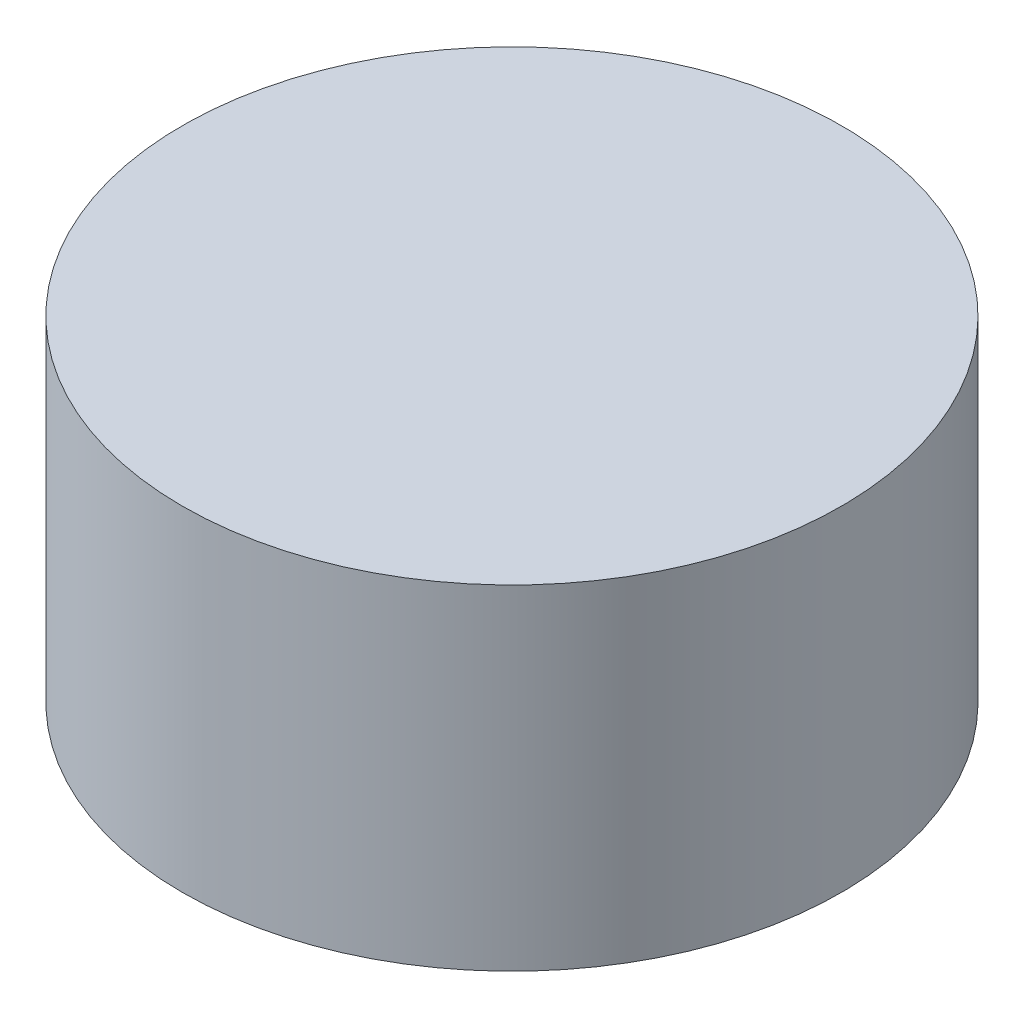
ISO-10303-21;
HEADER;
FILE_DESCRIPTION(('STEP AP214'),'2;1');
FILE_NAME('part.step','',(''),(''),'','','');
FILE_SCHEMA(('AUTOMOTIVE_DESIGN { 1 0 10303 214 1 1 1 1 }'));
ENDSEC;
DATA;
#1=APPLICATION_CONTEXT('core data for automotive mechanical design processes');
#2=APPLICATION_PROTOCOL_DEFINITION('international standard','automotive_design',2000,#1);
#3=PRODUCT_CONTEXT('',#1,'mechanical');
#4=PRODUCT('Part','Part','',(#3));
#5=PRODUCT_RELATED_PRODUCT_CATEGORY('part','',(#4));
#6=PRODUCT_DEFINITION_FORMATION('','',#4);
#7=PRODUCT_DEFINITION_CONTEXT('part definition',#1,'design');
#8=PRODUCT_DEFINITION('design','',#6,#7);
#9=PRODUCT_DEFINITION_SHAPE('','',#8);
#10=(LENGTH_UNIT() NAMED_UNIT(*) SI_UNIT(.MILLI.,.METRE.));
#11=(NAMED_UNIT(*) PLANE_ANGLE_UNIT() SI_UNIT($,.RADIAN.));
#12=(NAMED_UNIT(*) SI_UNIT($,.STERADIAN.) SOLID_ANGLE_UNIT());
#13=UNCERTAINTY_MEASURE_WITH_UNIT(LENGTH_MEASURE(1.E-05),#10,'distance_accuracy_value','');
#14=(GEOMETRIC_REPRESENTATION_CONTEXT(3) GLOBAL_UNCERTAINTY_ASSIGNED_CONTEXT((#13)) GLOBAL_UNIT_ASSIGNED_CONTEXT((#10,
#11,#12)) REPRESENTATION_CONTEXT('',''));
#15=CARTESIAN_POINT('',(0.,0.,0.));
#16=DIRECTION('',(0.,0.,1.));
#17=DIRECTION('',(1.,0.,0.));
#18=AXIS2_PLACEMENT_3D('',#15,#16,#17);
#19=CARTESIAN_POINT('',(0.,79.4494159207644,0.));
#20=DIRECTION('',(0.,-1.,0.));
#21=DIRECTION('',(0.,0.,-1.));
#22=AXIS2_PLACEMENT_3D('',#19,#20,#21);
#23=CYLINDRICAL_SURFACE('',#22,78.2753756689911);
#24=CARTESIAN_POINT('',(0.,79.4494159207644,0.));
#25=DIRECTION('',(0.,1.,0.));
#26=DIRECTION('',(0.,0.,1.));
#27=AXIS2_PLACEMENT_3D('',#24,#25,#26);
#28=CIRCLE('',#27,78.2753756689911);
#29=CARTESIAN_POINT('',(0.,79.4494159207644,78.2753756689911));
#30=VERTEX_POINT('',#29);
#31=EDGE_CURVE('E10',#30,#30,#28,.T.);
#32=ORIENTED_EDGE('',*,*,#31,.F.);
#33=EDGE_LOOP('',(#32));
#34=FACE_BOUND('',#33,.T.);
#35=CARTESIAN_POINT('',(0.,0.,0.));
#36=DIRECTION('',(0.,1.,0.));
#37=DIRECTION('',(0.,0.,1.));
#38=AXIS2_PLACEMENT_3D('',#35,#36,#37);
#39=CIRCLE('',#38,78.2753756689911);
#40=CARTESIAN_POINT('',(0.,0.,78.2753756689911));
#41=VERTEX_POINT('',#40);
#42=EDGE_CURVE('E35',#41,#41,#39,.T.);
#43=ORIENTED_EDGE('',*,*,#42,.T.);
#44=EDGE_LOOP('',(#43));
#45=FACE_BOUND('',#44,.T.);
#46=ADVANCED_FACE('F32',(#34,#45),#23,.T.);
#47=CARTESIAN_POINT('',(0.,79.4494159207644,0.));
#48=DIRECTION('',(0.,1.,0.));
#49=DIRECTION('',(0.,0.,1.));
#50=AXIS2_PLACEMENT_3D('',#47,#48,#49);
#51=PLANE('',#50);
#52=ORIENTED_EDGE('',*,*,#31,.T.);
#53=EDGE_LOOP('',(#52));
#54=FACE_BOUND('',#53,.T.);
#55=ADVANCED_FACE('F47',(#54),#51,.T.);
#56=CARTESIAN_POINT('',(0.,0.,0.));
#57=DIRECTION('',(0.,1.,0.));
#58=DIRECTION('',(0.,0.,1.));
#59=AXIS2_PLACEMENT_3D('',#56,#57,#58);
#60=PLANE('',#59);
#61=ORIENTED_EDGE('',*,*,#42,.F.);
#62=EDGE_LOOP('',(#61));
#63=FACE_BOUND('',#62,.T.);
#64=ADVANCED_FACE('F45',(#63),#60,.F.);
#65=CLOSED_SHELL('',(#46,#55,#64));
#66=MANIFOLD_SOLID_BREP('B2',#65);
#67=ADVANCED_BREP_SHAPE_REPRESENTATION('',(#18,#66),#14);
#68=SHAPE_DEFINITION_REPRESENTATION(#9,#67);
ENDSEC;
END-ISO-10303-21;
